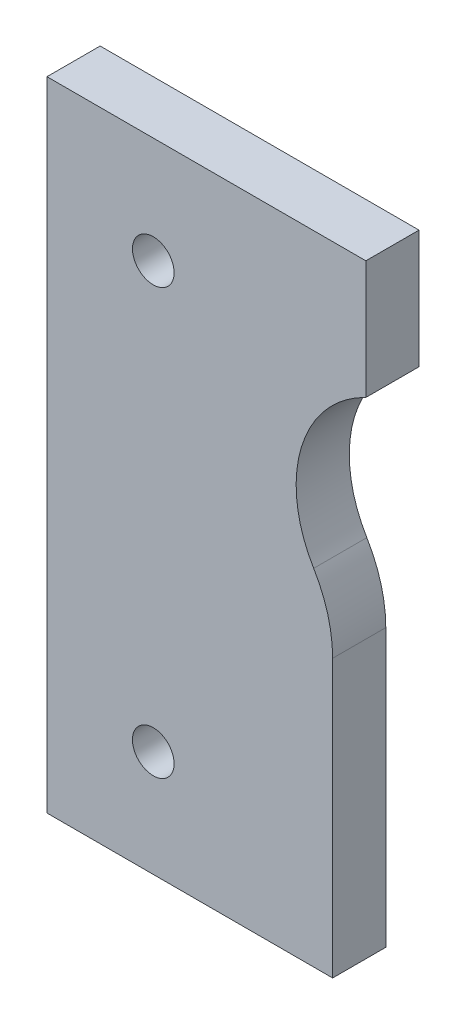
ISO-10303-21;
HEADER;
FILE_DESCRIPTION(('STEP AP214'),'2;1');
FILE_NAME('part.step','',(''),(''),'','','');
FILE_SCHEMA(('AUTOMOTIVE_DESIGN { 1 0 10303 214 1 1 1 1 }'));
ENDSEC;
DATA;
#1=APPLICATION_CONTEXT('core data for automotive mechanical design processes');
#2=APPLICATION_PROTOCOL_DEFINITION('international standard','automotive_design',2000,#1);
#3=PRODUCT_CONTEXT('',#1,'mechanical');
#4=PRODUCT('Part','Part','',(#3));
#5=PRODUCT_RELATED_PRODUCT_CATEGORY('part','',(#4));
#6=PRODUCT_DEFINITION_FORMATION('','',#4);
#7=PRODUCT_DEFINITION_CONTEXT('part definition',#1,'design');
#8=PRODUCT_DEFINITION('design','',#6,#7);
#9=PRODUCT_DEFINITION_SHAPE('','',#8);
#10=(LENGTH_UNIT() NAMED_UNIT(*) SI_UNIT(.MILLI.,.METRE.));
#11=(NAMED_UNIT(*) PLANE_ANGLE_UNIT() SI_UNIT($,.RADIAN.));
#12=(NAMED_UNIT(*) SI_UNIT($,.STERADIAN.) SOLID_ANGLE_UNIT());
#13=UNCERTAINTY_MEASURE_WITH_UNIT(LENGTH_MEASURE(1.E-05),#10,'distance_accuracy_value','');
#14=(GEOMETRIC_REPRESENTATION_CONTEXT(3) GLOBAL_UNCERTAINTY_ASSIGNED_CONTEXT((#13)) GLOBAL_UNIT_ASSIGNED_CONTEXT((#10,
#11,#12)) REPRESENTATION_CONTEXT('',''));
#15=CARTESIAN_POINT('',(0.,0.,0.));
#16=DIRECTION('',(0.,0.,1.));
#17=DIRECTION('',(1.,0.,0.));
#18=AXIS2_PLACEMENT_3D('',#15,#16,#17);
#19=CARTESIAN_POINT('',(-26.1937499999968,-15.7343197939272,3.175));
#20=DIRECTION('',(0.,0.,1.));
#21=DIRECTION('',(1.,0.,0.));
#22=AXIS2_PLACEMENT_3D('',#19,#20,#21);
#23=PLANE('',#22);
#24=CARTESIAN_POINT('',(-31.75,14.6812,3.175));
#25=DIRECTION('',(0.,0.,1.));
#26=DIRECTION('',(1.,0.,0.));
#27=AXIS2_PLACEMENT_3D('',#24,#25,#26);
#28=CIRCLE('',#27,2.4892);
#29=CARTESIAN_POINT('',(-29.2608,14.6812,3.175));
#30=VERTEX_POINT('',#29);
#31=EDGE_CURVE('E142',#30,#30,#28,.T.);
#32=ORIENTED_EDGE('',*,*,#31,.F.);
#33=EDGE_LOOP('',(#32));
#34=FACE_BOUND('',#33,.T.);
#35=DIRECTION('',(1.,0.,0.));
#36=VECTOR('',#35,1.);
#37=CARTESIAN_POINT('',(-44.45,-48.8188,3.175));
#38=LINE('',#37,#36);
#39=CARTESIAN_POINT('',(-44.45,-48.8188,3.175));
#40=VERTEX_POINT('',#39);
#41=CARTESIAN_POINT('',(-10.3187499999984,-48.8188,3.175));
#42=VERTEX_POINT('',#41);
#43=EDGE_CURVE('E157',#40,#42,#38,.T.);
#44=ORIENTED_EDGE('',*,*,#43,.T.);
#45=DIRECTION('',(0.,1.,0.));
#46=VECTOR('',#45,1.);
#47=CARTESIAN_POINT('',(-10.3187499999984,-15.7343197939272,3.175));
#48=LINE('',#47,#46);
#49=CARTESIAN_POINT('',(-10.3187499999984,-15.7343197939272,3.175));
#50=VERTEX_POINT('',#49);
#51=EDGE_CURVE('E99',#42,#50,#48,.T.);
#52=ORIENTED_EDGE('',*,*,#51,.T.);
#53=CARTESIAN_POINT('',(-26.1937499999968,-15.7343197939272,3.175));
#54=DIRECTION('',(0.,0.,1.));
#55=DIRECTION('',(1.,0.,0.));
#56=AXIS2_PLACEMENT_3D('',#53,#54,#55);
#57=CIRCLE('',#56,15.8749999999984);
#58=CARTESIAN_POINT('',(-12.585193266832,-7.55979787272687,3.175));
#59=VERTEX_POINT('',#58);
#60=EDGE_CURVE('E174',#50,#59,#57,.T.);
#61=ORIENTED_EDGE('',*,*,#60,.T.);
#62=CARTESIAN_POINT('',(0.,0.,3.175));
#63=DIRECTION('',(0.,0.,-1.));
#64=DIRECTION('',(1.,0.,0.));
#65=AXIS2_PLACEMENT_3D('',#62,#63,#64);
#66=CIRCLE('',#65,14.6812);
#67=CARTESIAN_POINT('',(-6.35,13.2368853375709,3.175));
#68=VERTEX_POINT('',#67);
#69=EDGE_CURVE('E115',#59,#68,#66,.T.);
#70=ORIENTED_EDGE('',*,*,#69,.T.);
#71=DIRECTION('',(0.,1.,0.));
#72=VECTOR('',#71,1.);
#73=CARTESIAN_POINT('',(-6.35,27.3812,3.175));
#74=LINE('',#73,#72);
#75=CARTESIAN_POINT('',(-6.35,27.3812,3.175));
#76=VERTEX_POINT('',#75);
#77=EDGE_CURVE('E109',#68,#76,#74,.T.);
#78=ORIENTED_EDGE('',*,*,#77,.T.);
#79=DIRECTION('',(-1.,0.,0.));
#80=VECTOR('',#79,1.);
#81=CARTESIAN_POINT('',(-6.35,27.3812,3.175));
#82=LINE('',#81,#80);
#83=CARTESIAN_POINT('',(-44.45,27.3812,3.175));
#84=VERTEX_POINT('',#83);
#85=EDGE_CURVE('E113',#76,#84,#82,.T.);
#86=ORIENTED_EDGE('',*,*,#85,.T.);
#87=DIRECTION('',(0.,-1.,0.));
#88=VECTOR('',#87,1.);
#89=CARTESIAN_POINT('',(-44.45,27.3812,3.175));
#90=LINE('',#89,#88);
#91=EDGE_CURVE('E59',#84,#40,#90,.T.);
#92=ORIENTED_EDGE('',*,*,#91,.T.);
#93=EDGE_LOOP('',(#44,#52,#61,#70,#78,#86,#92));
#94=FACE_BOUND('',#93,.T.);
#95=CARTESIAN_POINT('',(-31.75,-36.1188,3.175));
#96=DIRECTION('',(0.,0.,1.));
#97=DIRECTION('',(1.,0.,0.));
#98=AXIS2_PLACEMENT_3D('',#95,#96,#97);
#99=CIRCLE('',#98,2.4892);
#100=CARTESIAN_POINT('',(-29.2608,-36.1188,3.175));
#101=VERTEX_POINT('',#100);
#102=EDGE_CURVE('E194',#101,#101,#99,.T.);
#103=ORIENTED_EDGE('',*,*,#102,.F.);
#104=EDGE_LOOP('',(#103));
#105=FACE_BOUND('',#104,.T.);
#106=ADVANCED_FACE('F41',(#34,#94,#105),#23,.T.);
#107=CARTESIAN_POINT('',(-26.1937499999968,-15.7343197939272,-3.175));
#108=DIRECTION('',(0.,0.,1.));
#109=DIRECTION('',(1.,0.,0.));
#110=AXIS2_PLACEMENT_3D('',#107,#108,#109);
#111=PLANE('',#110);
#112=DIRECTION('',(1.,0.,0.));
#113=VECTOR('',#112,1.);
#114=CARTESIAN_POINT('',(-44.45,-48.8188,-3.175));
#115=LINE('',#114,#113);
#116=CARTESIAN_POINT('',(-44.45,-48.8188,-3.175));
#117=VERTEX_POINT('',#116);
#118=CARTESIAN_POINT('',(-10.3187499999984,-48.8188,-3.175));
#119=VERTEX_POINT('',#118);
#120=EDGE_CURVE('E137',#117,#119,#115,.T.);
#121=ORIENTED_EDGE('',*,*,#120,.F.);
#122=DIRECTION('',(0.,-1.,0.));
#123=VECTOR('',#122,1.);
#124=CARTESIAN_POINT('',(-44.45,27.3812,-3.175));
#125=LINE('',#124,#123);
#126=CARTESIAN_POINT('',(-44.45,27.3812,-3.175));
#127=VERTEX_POINT('',#126);
#128=EDGE_CURVE('E91',#127,#117,#125,.T.);
#129=ORIENTED_EDGE('',*,*,#128,.F.);
#130=DIRECTION('',(-1.,0.,0.));
#131=VECTOR('',#130,1.);
#132=CARTESIAN_POINT('',(-6.35,27.3812,-3.175));
#133=LINE('',#132,#131);
#134=CARTESIAN_POINT('',(-6.35,27.3812,-3.175));
#135=VERTEX_POINT('',#134);
#136=EDGE_CURVE('E85',#135,#127,#133,.T.);
#137=ORIENTED_EDGE('',*,*,#136,.F.);
#138=DIRECTION('',(0.,1.,0.));
#139=VECTOR('',#138,1.);
#140=CARTESIAN_POINT('',(-6.35,27.3812,-3.175));
#141=LINE('',#140,#139);
#142=CARTESIAN_POINT('',(-6.35,13.2368853375709,-3.175));
#143=VERTEX_POINT('',#142);
#144=EDGE_CURVE('E124',#143,#135,#141,.T.);
#145=ORIENTED_EDGE('',*,*,#144,.F.);
#146=CARTESIAN_POINT('',(0.,0.,-3.175));
#147=DIRECTION('',(0.,0.,-1.));
#148=DIRECTION('',(1.,0.,0.));
#149=AXIS2_PLACEMENT_3D('',#146,#147,#148);
#150=CIRCLE('',#149,14.6812);
#151=CARTESIAN_POINT('',(-12.585193266832,-7.55979787272687,-3.175));
#152=VERTEX_POINT('',#151);
#153=EDGE_CURVE('E148',#152,#143,#150,.T.);
#154=ORIENTED_EDGE('',*,*,#153,.F.);
#155=CARTESIAN_POINT('',(-26.1937499999968,-15.7343197939272,-3.175));
#156=DIRECTION('',(0.,0.,1.));
#157=DIRECTION('',(1.,0.,0.));
#158=AXIS2_PLACEMENT_3D('',#155,#156,#157);
#159=CIRCLE('',#158,15.8749999999984);
#160=CARTESIAN_POINT('',(-10.3187499999984,-15.7343197939272,-3.175));
#161=VERTEX_POINT('',#160);
#162=EDGE_CURVE('E145',#161,#152,#159,.T.);
#163=ORIENTED_EDGE('',*,*,#162,.F.);
#164=DIRECTION('',(0.,1.,0.));
#165=VECTOR('',#164,1.);
#166=CARTESIAN_POINT('',(-10.3187499999984,-15.7343197939272,-3.175));
#167=LINE('',#166,#165);
#168=EDGE_CURVE('E141',#119,#161,#167,.T.);
#169=ORIENTED_EDGE('',*,*,#168,.F.);
#170=EDGE_LOOP('',(#121,#129,#137,#145,#154,#163,#169));
#171=FACE_BOUND('',#170,.T.);
#172=CARTESIAN_POINT('',(-31.75,14.6812,-3.175));
#173=DIRECTION('',(0.,0.,1.));
#174=DIRECTION('',(1.,0.,0.));
#175=AXIS2_PLACEMENT_3D('',#172,#173,#174);
#176=CIRCLE('',#175,2.4892);
#177=CARTESIAN_POINT('',(-29.2608,14.6812,-3.175));
#178=VERTEX_POINT('',#177);
#179=EDGE_CURVE('E190',#178,#178,#176,.T.);
#180=ORIENTED_EDGE('',*,*,#179,.T.);
#181=EDGE_LOOP('',(#180));
#182=FACE_BOUND('',#181,.T.);
#183=CARTESIAN_POINT('',(-31.75,-36.1188,-3.175));
#184=DIRECTION('',(0.,0.,1.));
#185=DIRECTION('',(1.,0.,0.));
#186=AXIS2_PLACEMENT_3D('',#183,#184,#185);
#187=CIRCLE('',#186,2.4892);
#188=CARTESIAN_POINT('',(-29.2608,-36.1188,-3.175));
#189=VERTEX_POINT('',#188);
#190=EDGE_CURVE('E198',#189,#189,#187,.T.);
#191=ORIENTED_EDGE('',*,*,#190,.T.);
#192=EDGE_LOOP('',(#191));
#193=FACE_BOUND('',#192,.T.);
#194=ADVANCED_FACE('F178',(#171,#182,#193),#111,.F.);
#195=CARTESIAN_POINT('',(-44.45,-48.8188,3.175));
#196=DIRECTION('',(0.,1.,0.));
#197=DIRECTION('',(0.,0.,1.));
#198=AXIS2_PLACEMENT_3D('',#195,#196,#197);
#199=PLANE('',#198);
#200=ORIENTED_EDGE('',*,*,#120,.T.);
#201=DIRECTION('',(0.,0.,-1.));
#202=VECTOR('',#201,1.);
#203=CARTESIAN_POINT('',(-10.3187499999984,-48.8188,3.175));
#204=LINE('',#203,#202);
#205=EDGE_CURVE('E11',#42,#119,#204,.T.);
#206=ORIENTED_EDGE('',*,*,#205,.F.);
#207=ORIENTED_EDGE('',*,*,#43,.F.);
#208=DIRECTION('',(0.,0.,-1.));
#209=VECTOR('',#208,1.);
#210=CARTESIAN_POINT('',(-44.45,-48.8188,3.175));
#211=LINE('',#210,#209);
#212=EDGE_CURVE('E133',#40,#117,#211,.T.);
#213=ORIENTED_EDGE('',*,*,#212,.T.);
#214=EDGE_LOOP('',(#200,#206,#207,#213));
#215=FACE_BOUND('',#214,.T.);
#216=ADVANCED_FACE('F43',(#215),#199,.F.);
#217=CARTESIAN_POINT('',(-10.3187499999984,-15.7343197939272,3.175));
#218=DIRECTION('',(-1.,0.,0.));
#219=DIRECTION('',(0.,-1.,0.));
#220=AXIS2_PLACEMENT_3D('',#217,#218,#219);
#221=PLANE('',#220);
#222=ORIENTED_EDGE('',*,*,#168,.T.);
#223=DIRECTION('',(0.,0.,-1.));
#224=VECTOR('',#223,1.);
#225=CARTESIAN_POINT('',(-10.3187499999984,-15.7343197939272,3.175));
#226=LINE('',#225,#224);
#227=EDGE_CURVE('E51',#50,#161,#226,.T.);
#228=ORIENTED_EDGE('',*,*,#227,.F.);
#229=ORIENTED_EDGE('',*,*,#51,.F.);
#230=ORIENTED_EDGE('',*,*,#205,.T.);
#231=EDGE_LOOP('',(#222,#228,#229,#230));
#232=FACE_BOUND('',#231,.T.);
#233=ADVANCED_FACE('F230',(#232),#221,.F.);
#234=CARTESIAN_POINT('',(-26.1937499999968,-15.7343197939272,3.175));
#235=DIRECTION('',(0.,0.,-1.));
#236=DIRECTION('',(-1.,0.,0.));
#237=AXIS2_PLACEMENT_3D('',#234,#235,#236);
#238=CYLINDRICAL_SURFACE('',#237,15.8749999999984);
#239=ORIENTED_EDGE('',*,*,#162,.T.);
#240=DIRECTION('',(0.,0.,-1.));
#241=VECTOR('',#240,1.);
#242=CARTESIAN_POINT('',(-12.585193266832,-7.55979787272687,3.175));
#243=LINE('',#242,#241);
#244=EDGE_CURVE('E164',#59,#152,#243,.T.);
#245=ORIENTED_EDGE('',*,*,#244,.F.);
#246=ORIENTED_EDGE('',*,*,#60,.F.);
#247=ORIENTED_EDGE('',*,*,#227,.T.);
#248=EDGE_LOOP('',(#239,#245,#246,#247));
#249=FACE_BOUND('',#248,.T.);
#250=ADVANCED_FACE('F172',(#249),#238,.T.);
#251=CARTESIAN_POINT('',(0.,0.,3.175));
#252=DIRECTION('',(0.,0.,-1.));
#253=DIRECTION('',(-1.,0.,0.));
#254=AXIS2_PLACEMENT_3D('',#251,#252,#253);
#255=CYLINDRICAL_SURFACE('',#254,14.6812);
#256=ORIENTED_EDGE('',*,*,#153,.T.);
#257=DIRECTION('',(0.,0.,-1.));
#258=VECTOR('',#257,1.);
#259=CARTESIAN_POINT('',(-6.35,13.2368853375709,3.175));
#260=LINE('',#259,#258);
#261=EDGE_CURVE('E126',#68,#143,#260,.T.);
#262=ORIENTED_EDGE('',*,*,#261,.F.);
#263=ORIENTED_EDGE('',*,*,#69,.F.);
#264=ORIENTED_EDGE('',*,*,#244,.T.);
#265=EDGE_LOOP('',(#256,#262,#263,#264));
#266=FACE_BOUND('',#265,.T.);
#267=ADVANCED_FACE('F181',(#266),#255,.F.);
#268=CARTESIAN_POINT('',(-6.35,27.3812,3.175));
#269=DIRECTION('',(-1.,0.,0.));
#270=DIRECTION('',(0.,-1.,0.));
#271=AXIS2_PLACEMENT_3D('',#268,#269,#270);
#272=PLANE('',#271);
#273=ORIENTED_EDGE('',*,*,#144,.T.);
#274=DIRECTION('',(0.,0.,-1.));
#275=VECTOR('',#274,1.);
#276=CARTESIAN_POINT('',(-6.35,27.3812,3.175));
#277=LINE('',#276,#275);
#278=EDGE_CURVE('E121',#76,#135,#277,.T.);
#279=ORIENTED_EDGE('',*,*,#278,.F.);
#280=ORIENTED_EDGE('',*,*,#77,.F.);
#281=ORIENTED_EDGE('',*,*,#261,.T.);
#282=EDGE_LOOP('',(#273,#279,#280,#281));
#283=FACE_BOUND('',#282,.T.);
#284=ADVANCED_FACE('F122',(#283),#272,.F.);
#285=CARTESIAN_POINT('',(-6.35,27.3812,3.175));
#286=DIRECTION('',(0.,-1.,0.));
#287=DIRECTION('',(1.,0.,0.));
#288=AXIS2_PLACEMENT_3D('',#285,#286,#287);
#289=PLANE('',#288);
#290=ORIENTED_EDGE('',*,*,#136,.T.);
#291=DIRECTION('',(0.,0.,-1.));
#292=VECTOR('',#291,1.);
#293=CARTESIAN_POINT('',(-44.45,27.3812,3.175));
#294=LINE('',#293,#292);
#295=EDGE_CURVE('E127',#84,#127,#294,.T.);
#296=ORIENTED_EDGE('',*,*,#295,.F.);
#297=ORIENTED_EDGE('',*,*,#85,.F.);
#298=ORIENTED_EDGE('',*,*,#278,.T.);
#299=EDGE_LOOP('',(#290,#296,#297,#298));
#300=FACE_BOUND('',#299,.T.);
#301=ADVANCED_FACE('F129',(#300),#289,.F.);
#302=CARTESIAN_POINT('',(-44.45,27.3812,3.175));
#303=DIRECTION('',(1.,0.,0.));
#304=DIRECTION('',(0.,1.,0.));
#305=AXIS2_PLACEMENT_3D('',#302,#303,#304);
#306=PLANE('',#305);
#307=ORIENTED_EDGE('',*,*,#128,.T.);
#308=ORIENTED_EDGE('',*,*,#212,.F.);
#309=ORIENTED_EDGE('',*,*,#91,.F.);
#310=ORIENTED_EDGE('',*,*,#295,.T.);
#311=EDGE_LOOP('',(#307,#308,#309,#310));
#312=FACE_BOUND('',#311,.T.);
#313=ADVANCED_FACE('F220',(#312),#306,.F.);
#314=CARTESIAN_POINT('',(-31.75,14.6812,3.175));
#315=DIRECTION('',(0.,0.,-1.));
#316=DIRECTION('',(-1.,0.,0.));
#317=AXIS2_PLACEMENT_3D('',#314,#315,#316);
#318=CYLINDRICAL_SURFACE('',#317,2.4892);
#319=ORIENTED_EDGE('',*,*,#31,.T.);
#320=EDGE_LOOP('',(#319));
#321=FACE_BOUND('',#320,.T.);
#322=ORIENTED_EDGE('',*,*,#179,.F.);
#323=EDGE_LOOP('',(#322));
#324=FACE_BOUND('',#323,.T.);
#325=ADVANCED_FACE('F217',(#321,#324),#318,.F.);
#326=CARTESIAN_POINT('',(-31.75,-36.1188,3.175));
#327=DIRECTION('',(0.,0.,-1.));
#328=DIRECTION('',(-1.,0.,0.));
#329=AXIS2_PLACEMENT_3D('',#326,#327,#328);
#330=CYLINDRICAL_SURFACE('',#329,2.4892);
#331=ORIENTED_EDGE('',*,*,#102,.T.);
#332=EDGE_LOOP('',(#331));
#333=FACE_BOUND('',#332,.T.);
#334=ORIENTED_EDGE('',*,*,#190,.F.);
#335=EDGE_LOOP('',(#334));
#336=FACE_BOUND('',#335,.T.);
#337=ADVANCED_FACE('F206',(#333,#336),#330,.F.);
#338=CLOSED_SHELL('',(#106,#194,#216,#233,#250,#267,#284,#301,#313,#325,#337));
#339=MANIFOLD_SOLID_BREP('B2',#338);
#340=ADVANCED_BREP_SHAPE_REPRESENTATION('',(#18,#339),#14);
#341=SHAPE_DEFINITION_REPRESENTATION(#9,#340);
ENDSEC;
END-ISO-10303-21;
